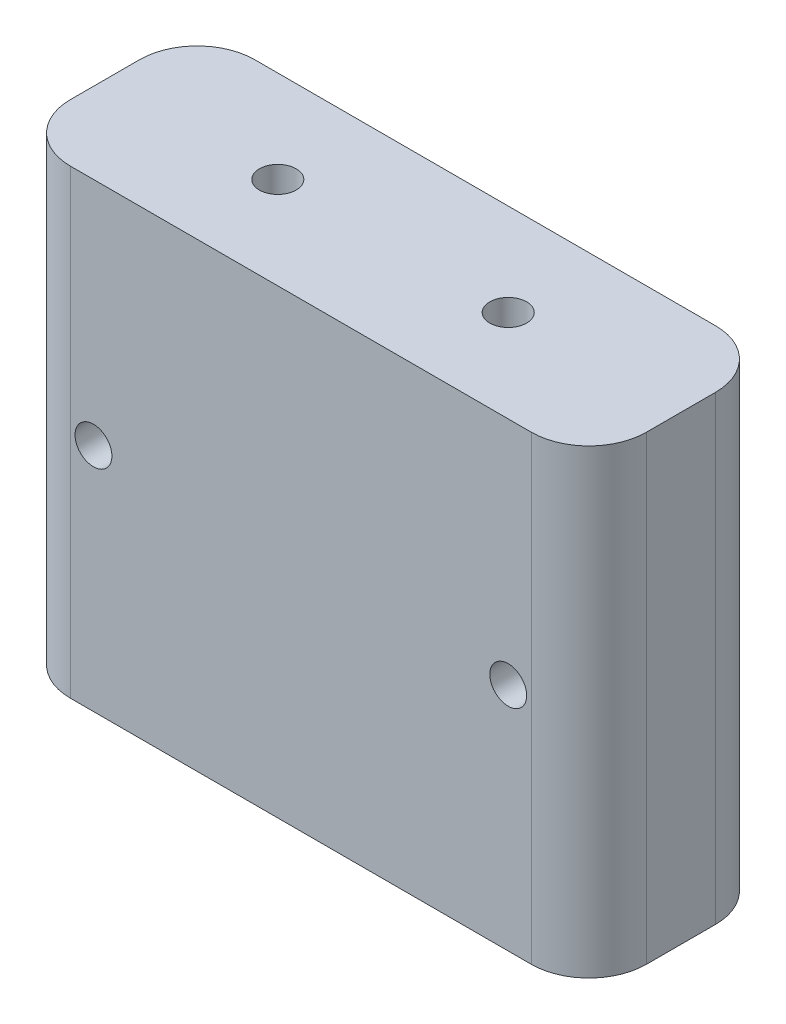
ISO-10303-21;
HEADER;
FILE_DESCRIPTION(('STEP AP214'),'2;1');
FILE_NAME('part.step','',(''),(''),'','','');
FILE_SCHEMA(('AUTOMOTIVE_DESIGN { 1 0 10303 214 1 1 1 1 }'));
ENDSEC;
DATA;
#1=APPLICATION_CONTEXT('core data for automotive mechanical design processes');
#2=APPLICATION_PROTOCOL_DEFINITION('international standard','automotive_design',2000,#1);
#3=PRODUCT_CONTEXT('',#1,'mechanical');
#4=PRODUCT('Part','Part','',(#3));
#5=PRODUCT_RELATED_PRODUCT_CATEGORY('part','',(#4));
#6=PRODUCT_DEFINITION_FORMATION('','',#4);
#7=PRODUCT_DEFINITION_CONTEXT('part definition',#1,'design');
#8=PRODUCT_DEFINITION('design','',#6,#7);
#9=PRODUCT_DEFINITION_SHAPE('','',#8);
#10=(LENGTH_UNIT() NAMED_UNIT(*) SI_UNIT(.MILLI.,.METRE.));
#11=(NAMED_UNIT(*) PLANE_ANGLE_UNIT() SI_UNIT($,.RADIAN.));
#12=(NAMED_UNIT(*) SI_UNIT($,.STERADIAN.) SOLID_ANGLE_UNIT());
#13=UNCERTAINTY_MEASURE_WITH_UNIT(LENGTH_MEASURE(1.E-05),#10,'distance_accuracy_value','');
#14=(GEOMETRIC_REPRESENTATION_CONTEXT(3) GLOBAL_UNCERTAINTY_ASSIGNED_CONTEXT((#13)) GLOBAL_UNIT_ASSIGNED_CONTEXT((#10,
#11,#12)) REPRESENTATION_CONTEXT('',''));
#15=CARTESIAN_POINT('',(0.,0.,0.));
#16=DIRECTION('',(0.,0.,1.));
#17=DIRECTION('',(1.,0.,0.));
#18=AXIS2_PLACEMENT_3D('',#15,#16,#17);
#19=CARTESIAN_POINT('',(0.,40.,0.));
#20=DIRECTION('',(0.,-1.,0.));
#21=DIRECTION('',(0.,0.,-1.));
#22=AXIS2_PLACEMENT_3D('',#19,#20,#21);
#23=PLANE('',#22);
#24=DIRECTION('',(0.,0.,-1.));
#25=VECTOR('',#24,1.);
#26=CARTESIAN_POINT('',(50.,40.,0.));
#27=LINE('',#26,#25);
#28=CARTESIAN_POINT('',(50.,40.,-5.));
#29=VERTEX_POINT('',#28);
#30=CARTESIAN_POINT('',(50.,40.,-11.));
#31=VERTEX_POINT('',#30);
#32=EDGE_CURVE('E196',#29,#31,#27,.T.);
#33=ORIENTED_EDGE('',*,*,#32,.T.);
#34=CARTESIAN_POINT('',(45.,40.,-11.));
#35=DIRECTION('',(0.,-1.,0.));
#36=DIRECTION('',(0.,0.,-1.));
#37=AXIS2_PLACEMENT_3D('',#34,#35,#36);
#38=CIRCLE('',#37,5.);
#39=CARTESIAN_POINT('',(45.,40.,-16.));
#40=VERTEX_POINT('',#39);
#41=EDGE_CURVE('E172',#31,#40,#38,.F.);
#42=ORIENTED_EDGE('',*,*,#41,.T.);
#43=DIRECTION('',(-1.,0.,0.));
#44=VECTOR('',#43,1.);
#45=CARTESIAN_POINT('',(0.,40.,-16.));
#46=LINE('',#45,#44);
#47=CARTESIAN_POINT('',(5.,40.,-16.));
#48=VERTEX_POINT('',#47);
#49=EDGE_CURVE('E130',#40,#48,#46,.T.);
#50=ORIENTED_EDGE('',*,*,#49,.T.);
#51=CARTESIAN_POINT('',(5.,40.,-11.));
#52=DIRECTION('',(0.,-1.,0.));
#53=DIRECTION('',(0.,0.,-1.));
#54=AXIS2_PLACEMENT_3D('',#51,#52,#53);
#55=CIRCLE('',#54,5.);
#56=CARTESIAN_POINT('',(0.,40.,-11.));
#57=VERTEX_POINT('',#56);
#58=EDGE_CURVE('E169',#48,#57,#55,.F.);
#59=ORIENTED_EDGE('',*,*,#58,.T.);
#60=DIRECTION('',(0.,0.,1.));
#61=VECTOR('',#60,1.);
#62=CARTESIAN_POINT('',(0.,40.,0.));
#63=LINE('',#62,#61);
#64=CARTESIAN_POINT('',(0.,40.,-5.));
#65=VERTEX_POINT('',#64);
#66=EDGE_CURVE('E139',#57,#65,#63,.T.);
#67=ORIENTED_EDGE('',*,*,#66,.T.);
#68=CARTESIAN_POINT('',(5.,40.,-5.));
#69=DIRECTION('',(0.,-1.,0.));
#70=DIRECTION('',(0.,0.,-1.));
#71=AXIS2_PLACEMENT_3D('',#68,#69,#70);
#72=CIRCLE('',#71,5.);
#73=CARTESIAN_POINT('',(5.,40.,0.));
#74=VERTEX_POINT('',#73);
#75=EDGE_CURVE('E64',#65,#74,#72,.F.);
#76=ORIENTED_EDGE('',*,*,#75,.T.);
#77=DIRECTION('',(1.,0.,0.));
#78=VECTOR('',#77,1.);
#79=CARTESIAN_POINT('',(0.,40.,0.));
#80=LINE('',#79,#78);
#81=CARTESIAN_POINT('',(45.,40.,0.));
#82=VERTEX_POINT('',#81);
#83=EDGE_CURVE('E144',#74,#82,#80,.T.);
#84=ORIENTED_EDGE('',*,*,#83,.T.);
#85=CARTESIAN_POINT('',(45.,40.,-5.));
#86=DIRECTION('',(0.,-1.,0.));
#87=DIRECTION('',(0.,0.,-1.));
#88=AXIS2_PLACEMENT_3D('',#85,#86,#87);
#89=CIRCLE('',#88,5.);
#90=EDGE_CURVE('E166',#82,#29,#89,.F.);
#91=ORIENTED_EDGE('',*,*,#90,.T.);
#92=EDGE_LOOP('',(#33,#42,#50,#59,#67,#76,#84,#91));
#93=FACE_BOUND('',#92,.T.);
#94=CARTESIAN_POINT('',(15.,40.,-8.));
#95=DIRECTION('',(0.,1.,0.));
#96=DIRECTION('',(0.,0.,1.));
#97=AXIS2_PLACEMENT_3D('',#94,#95,#96);
#98=CIRCLE('',#97,1.6);
#99=CARTESIAN_POINT('',(15.,40.,-6.4));
#100=VERTEX_POINT('',#99);
#101=EDGE_CURVE('E191',#100,#100,#98,.T.);
#102=ORIENTED_EDGE('',*,*,#101,.F.);
#103=EDGE_LOOP('',(#102));
#104=FACE_BOUND('',#103,.T.);
#105=CARTESIAN_POINT('',(35.,40.,-8.));
#106=DIRECTION('',(0.,1.,0.));
#107=DIRECTION('',(0.,0.,1.));
#108=AXIS2_PLACEMENT_3D('',#105,#106,#107);
#109=CIRCLE('',#108,1.6);
#110=CARTESIAN_POINT('',(35.,40.,-6.4));
#111=VERTEX_POINT('',#110);
#112=EDGE_CURVE('E206',#111,#111,#109,.T.);
#113=ORIENTED_EDGE('',*,*,#112,.F.);
#114=EDGE_LOOP('',(#113));
#115=FACE_BOUND('',#114,.T.);
#116=ADVANCED_FACE('F43',(#93,#104,#115),#23,.F.);
#117=CARTESIAN_POINT('',(0.,0.,0.));
#118=DIRECTION('',(0.,-1.,0.));
#119=DIRECTION('',(0.,0.,-1.));
#120=AXIS2_PLACEMENT_3D('',#117,#118,#119);
#121=PLANE('',#120);
#122=CARTESIAN_POINT('',(15.,0.,-8.));
#123=DIRECTION('',(0.,1.,0.));
#124=DIRECTION('',(0.,0.,1.));
#125=AXIS2_PLACEMENT_3D('',#122,#123,#124);
#126=CIRCLE('',#125,1.6);
#127=CARTESIAN_POINT('',(15.,0.,-6.4));
#128=VERTEX_POINT('',#127);
#129=EDGE_CURVE('E202',#128,#128,#126,.T.);
#130=ORIENTED_EDGE('',*,*,#129,.T.);
#131=EDGE_LOOP('',(#130));
#132=FACE_BOUND('',#131,.T.);
#133=DIRECTION('',(-1.,0.,0.));
#134=VECTOR('',#133,1.);
#135=CARTESIAN_POINT('',(0.,0.,-16.));
#136=LINE('',#135,#134);
#137=CARTESIAN_POINT('',(45.,0.,-16.));
#138=VERTEX_POINT('',#137);
#139=CARTESIAN_POINT('',(5.,0.,-16.));
#140=VERTEX_POINT('',#139);
#141=EDGE_CURVE('E127',#138,#140,#136,.T.);
#142=ORIENTED_EDGE('',*,*,#141,.F.);
#143=CARTESIAN_POINT('',(45.,0.,-11.));
#144=DIRECTION('',(0.,-1.,0.));
#145=DIRECTION('',(0.,0.,-1.));
#146=AXIS2_PLACEMENT_3D('',#143,#144,#145);
#147=CIRCLE('',#146,5.);
#148=CARTESIAN_POINT('',(50.,0.,-11.));
#149=VERTEX_POINT('',#148);
#150=EDGE_CURVE('E109',#138,#149,#147,.T.);
#151=ORIENTED_EDGE('',*,*,#150,.T.);
#152=DIRECTION('',(0.,0.,-1.));
#153=VECTOR('',#152,1.);
#154=CARTESIAN_POINT('',(50.,0.,0.));
#155=LINE('',#154,#153);
#156=CARTESIAN_POINT('',(50.,0.,-5.));
#157=VERTEX_POINT('',#156);
#158=EDGE_CURVE('E140',#157,#149,#155,.T.);
#159=ORIENTED_EDGE('',*,*,#158,.F.);
#160=CARTESIAN_POINT('',(45.,0.,-5.));
#161=DIRECTION('',(0.,-1.,0.));
#162=DIRECTION('',(0.,0.,-1.));
#163=AXIS2_PLACEMENT_3D('',#160,#161,#162);
#164=CIRCLE('',#163,5.);
#165=CARTESIAN_POINT('',(45.,0.,0.));
#166=VERTEX_POINT('',#165);
#167=EDGE_CURVE('E154',#157,#166,#164,.T.);
#168=ORIENTED_EDGE('',*,*,#167,.T.);
#169=DIRECTION('',(1.,0.,0.));
#170=VECTOR('',#169,1.);
#171=CARTESIAN_POINT('',(0.,0.,0.));
#172=LINE('',#171,#170);
#173=CARTESIAN_POINT('',(5.,0.,0.));
#174=VERTEX_POINT('',#173);
#175=EDGE_CURVE('E146',#174,#166,#172,.T.);
#176=ORIENTED_EDGE('',*,*,#175,.F.);
#177=CARTESIAN_POINT('',(5.,0.,-5.));
#178=DIRECTION('',(0.,-1.,0.));
#179=DIRECTION('',(0.,0.,-1.));
#180=AXIS2_PLACEMENT_3D('',#177,#178,#179);
#181=CIRCLE('',#180,5.);
#182=CARTESIAN_POINT('',(0.,0.,-5.));
#183=VERTEX_POINT('',#182);
#184=EDGE_CURVE('E132',#174,#183,#181,.T.);
#185=ORIENTED_EDGE('',*,*,#184,.T.);
#186=DIRECTION('',(0.,0.,1.));
#187=VECTOR('',#186,1.);
#188=CARTESIAN_POINT('',(0.,0.,0.));
#189=LINE('',#188,#187);
#190=CARTESIAN_POINT('',(0.,0.,-11.));
#191=VERTEX_POINT('',#190);
#192=EDGE_CURVE('E189',#191,#183,#189,.T.);
#193=ORIENTED_EDGE('',*,*,#192,.F.);
#194=CARTESIAN_POINT('',(5.,0.,-11.));
#195=DIRECTION('',(0.,-1.,0.));
#196=DIRECTION('',(0.,0.,-1.));
#197=AXIS2_PLACEMENT_3D('',#194,#195,#196);
#198=CIRCLE('',#197,5.);
#199=EDGE_CURVE('E121',#191,#140,#198,.T.);
#200=ORIENTED_EDGE('',*,*,#199,.T.);
#201=EDGE_LOOP('',(#142,#151,#159,#168,#176,#185,#193,#200));
#202=FACE_BOUND('',#201,.T.);
#203=CARTESIAN_POINT('',(35.,0.,-8.));
#204=DIRECTION('',(0.,1.,0.));
#205=DIRECTION('',(0.,0.,1.));
#206=AXIS2_PLACEMENT_3D('',#203,#204,#205);
#207=CIRCLE('',#206,1.6);
#208=CARTESIAN_POINT('',(35.,0.,-6.4));
#209=VERTEX_POINT('',#208);
#210=EDGE_CURVE('E210',#209,#209,#207,.T.);
#211=ORIENTED_EDGE('',*,*,#210,.T.);
#212=EDGE_LOOP('',(#211));
#213=FACE_BOUND('',#212,.T.);
#214=ADVANCED_FACE('F135',(#132,#202,#213),#121,.T.);
#215=CARTESIAN_POINT('',(0.,40.,0.));
#216=DIRECTION('',(1.,0.,0.));
#217=DIRECTION('',(0.,0.,-1.));
#218=AXIS2_PLACEMENT_3D('',#215,#216,#217);
#219=PLANE('',#218);
#220=ORIENTED_EDGE('',*,*,#66,.F.);
#221=DIRECTION('',(0.,-1.,0.));
#222=VECTOR('',#221,1.);
#223=CARTESIAN_POINT('',(0.,40.,-11.));
#224=LINE('',#223,#222);
#225=EDGE_CURVE('E178',#57,#191,#224,.T.);
#226=ORIENTED_EDGE('',*,*,#225,.T.);
#227=ORIENTED_EDGE('',*,*,#192,.T.);
#228=DIRECTION('',(0.,-1.,0.));
#229=VECTOR('',#228,1.);
#230=CARTESIAN_POINT('',(0.,40.,-5.));
#231=LINE('',#230,#229);
#232=EDGE_CURVE('E175',#183,#65,#231,.F.);
#233=ORIENTED_EDGE('',*,*,#232,.T.);
#234=EDGE_LOOP('',(#220,#226,#227,#233));
#235=FACE_BOUND('',#234,.T.);
#236=ADVANCED_FACE('F246',(#235),#219,.F.);
#237=CARTESIAN_POINT('',(0.,40.,0.));
#238=DIRECTION('',(0.,0.,-1.));
#239=DIRECTION('',(-1.,0.,0.));
#240=AXIS2_PLACEMENT_3D('',#237,#238,#239);
#241=PLANE('',#240);
#242=CARTESIAN_POINT('',(7.,20.,0.));
#243=DIRECTION('',(0.,0.,1.));
#244=DIRECTION('',(1.,0.,0.));
#245=AXIS2_PLACEMENT_3D('',#242,#243,#244);
#246=CIRCLE('',#245,1.6);
#247=CARTESIAN_POINT('',(8.6,20.,0.));
#248=VERTEX_POINT('',#247);
#249=EDGE_CURVE('E226',#248,#248,#246,.T.);
#250=ORIENTED_EDGE('',*,*,#249,.F.);
#251=EDGE_LOOP('',(#250));
#252=FACE_BOUND('',#251,.T.);
#253=CARTESIAN_POINT('',(43.,20.,0.));
#254=DIRECTION('',(0.,0.,1.));
#255=DIRECTION('',(1.,0.,0.));
#256=AXIS2_PLACEMENT_3D('',#253,#254,#255);
#257=CIRCLE('',#256,1.6);
#258=CARTESIAN_POINT('',(44.6,20.,0.));
#259=VERTEX_POINT('',#258);
#260=EDGE_CURVE('E222',#259,#259,#257,.T.);
#261=ORIENTED_EDGE('',*,*,#260,.F.);
#262=EDGE_LOOP('',(#261));
#263=FACE_BOUND('',#262,.T.);
#264=ORIENTED_EDGE('',*,*,#175,.T.);
#265=DIRECTION('',(0.,-1.,0.));
#266=VECTOR('',#265,1.);
#267=CARTESIAN_POINT('',(45.,40.,0.));
#268=LINE('',#267,#266);
#269=EDGE_CURVE('E11',#166,#82,#268,.F.);
#270=ORIENTED_EDGE('',*,*,#269,.T.);
#271=ORIENTED_EDGE('',*,*,#83,.F.);
#272=DIRECTION('',(0.,-1.,0.));
#273=VECTOR('',#272,1.);
#274=CARTESIAN_POINT('',(5.,40.,0.));
#275=LINE('',#274,#273);
#276=EDGE_CURVE('E52',#74,#174,#275,.T.);
#277=ORIENTED_EDGE('',*,*,#276,.T.);
#278=EDGE_LOOP('',(#264,#270,#271,#277));
#279=FACE_BOUND('',#278,.T.);
#280=ADVANCED_FACE('F185',(#252,#263,#279),#241,.F.);
#281=CARTESIAN_POINT('',(50.,40.,0.));
#282=DIRECTION('',(-1.,0.,0.));
#283=DIRECTION('',(0.,0.,1.));
#284=AXIS2_PLACEMENT_3D('',#281,#282,#283);
#285=PLANE('',#284);
#286=ORIENTED_EDGE('',*,*,#158,.T.);
#287=DIRECTION('',(0.,-1.,0.));
#288=VECTOR('',#287,1.);
#289=CARTESIAN_POINT('',(50.,40.,-11.));
#290=LINE('',#289,#288);
#291=EDGE_CURVE('E114',#149,#31,#290,.F.);
#292=ORIENTED_EDGE('',*,*,#291,.T.);
#293=ORIENTED_EDGE('',*,*,#32,.F.);
#294=DIRECTION('',(0.,-1.,0.));
#295=VECTOR('',#294,1.);
#296=CARTESIAN_POINT('',(50.,40.,-5.));
#297=LINE('',#296,#295);
#298=EDGE_CURVE('E120',#29,#157,#297,.T.);
#299=ORIENTED_EDGE('',*,*,#298,.T.);
#300=EDGE_LOOP('',(#286,#292,#293,#299));
#301=FACE_BOUND('',#300,.T.);
#302=ADVANCED_FACE('F245',(#301),#285,.F.);
#303=CARTESIAN_POINT('',(0.,40.,-16.));
#304=DIRECTION('',(0.,0.,1.));
#305=DIRECTION('',(1.,0.,0.));
#306=AXIS2_PLACEMENT_3D('',#303,#304,#305);
#307=PLANE('',#306);
#308=CARTESIAN_POINT('',(7.,20.,-16.));
#309=DIRECTION('',(0.,0.,1.));
#310=DIRECTION('',(1.,0.,0.));
#311=AXIS2_PLACEMENT_3D('',#308,#309,#310);
#312=CIRCLE('',#311,1.6);
#313=CARTESIAN_POINT('',(8.6,20.,-16.));
#314=VERTEX_POINT('',#313);
#315=EDGE_CURVE('E214',#314,#314,#312,.T.);
#316=ORIENTED_EDGE('',*,*,#315,.T.);
#317=EDGE_LOOP('',(#316));
#318=FACE_BOUND('',#317,.T.);
#319=CARTESIAN_POINT('',(43.,20.,-16.));
#320=DIRECTION('',(0.,0.,1.));
#321=DIRECTION('',(1.,0.,0.));
#322=AXIS2_PLACEMENT_3D('',#319,#320,#321);
#323=CIRCLE('',#322,1.6);
#324=CARTESIAN_POINT('',(44.6,20.,-16.));
#325=VERTEX_POINT('',#324);
#326=EDGE_CURVE('E218',#325,#325,#323,.T.);
#327=ORIENTED_EDGE('',*,*,#326,.T.);
#328=EDGE_LOOP('',(#327));
#329=FACE_BOUND('',#328,.T.);
#330=ORIENTED_EDGE('',*,*,#49,.F.);
#331=DIRECTION('',(0.,-1.,0.));
#332=VECTOR('',#331,1.);
#333=CARTESIAN_POINT('',(45.,40.,-16.));
#334=LINE('',#333,#332);
#335=EDGE_CURVE('E113',#40,#138,#334,.T.);
#336=ORIENTED_EDGE('',*,*,#335,.T.);
#337=ORIENTED_EDGE('',*,*,#141,.T.);
#338=DIRECTION('',(0.,-1.,0.));
#339=VECTOR('',#338,1.);
#340=CARTESIAN_POINT('',(5.,40.,-16.));
#341=LINE('',#340,#339);
#342=EDGE_CURVE('E133',#140,#48,#341,.F.);
#343=ORIENTED_EDGE('',*,*,#342,.T.);
#344=EDGE_LOOP('',(#330,#336,#337,#343));
#345=FACE_BOUND('',#344,.T.);
#346=ADVANCED_FACE('F126',(#318,#329,#345),#307,.F.);
#347=CARTESIAN_POINT('',(15.,40.,-8.));
#348=DIRECTION('',(0.,-1.,0.));
#349=DIRECTION('',(0.,0.,-1.));
#350=AXIS2_PLACEMENT_3D('',#347,#348,#349);
#351=CYLINDRICAL_SURFACE('',#350,1.6);
#352=ORIENTED_EDGE('',*,*,#101,.T.);
#353=EDGE_LOOP('',(#352));
#354=FACE_BOUND('',#353,.T.);
#355=ORIENTED_EDGE('',*,*,#129,.F.);
#356=EDGE_LOOP('',(#355));
#357=FACE_BOUND('',#356,.T.);
#358=ADVANCED_FACE('F257',(#354,#357),#351,.F.);
#359=CARTESIAN_POINT('',(35.,40.,-8.));
#360=DIRECTION('',(0.,-1.,0.));
#361=DIRECTION('',(0.,0.,-1.));
#362=AXIS2_PLACEMENT_3D('',#359,#360,#361);
#363=CYLINDRICAL_SURFACE('',#362,1.6);
#364=ORIENTED_EDGE('',*,*,#112,.T.);
#365=EDGE_LOOP('',(#364));
#366=FACE_BOUND('',#365,.T.);
#367=ORIENTED_EDGE('',*,*,#210,.F.);
#368=EDGE_LOOP('',(#367));
#369=FACE_BOUND('',#368,.T.);
#370=ADVANCED_FACE('F251',(#366,#369),#363,.F.);
#371=CARTESIAN_POINT('',(43.,20.,-16.));
#372=DIRECTION('',(0.,0.,1.));
#373=DIRECTION('',(1.,0.,0.));
#374=AXIS2_PLACEMENT_3D('',#371,#372,#373);
#375=CYLINDRICAL_SURFACE('',#374,1.6);
#376=ORIENTED_EDGE('',*,*,#326,.F.);
#377=EDGE_LOOP('',(#376));
#378=FACE_BOUND('',#377,.T.);
#379=ORIENTED_EDGE('',*,*,#260,.T.);
#380=EDGE_LOOP('',(#379));
#381=FACE_BOUND('',#380,.T.);
#382=ADVANCED_FACE('F239',(#378,#381),#375,.F.);
#383=CARTESIAN_POINT('',(7.,20.,-16.));
#384=DIRECTION('',(0.,0.,1.));
#385=DIRECTION('',(1.,0.,0.));
#386=AXIS2_PLACEMENT_3D('',#383,#384,#385);
#387=CYLINDRICAL_SURFACE('',#386,1.6);
#388=ORIENTED_EDGE('',*,*,#315,.F.);
#389=EDGE_LOOP('',(#388));
#390=FACE_BOUND('',#389,.T.);
#391=ORIENTED_EDGE('',*,*,#249,.T.);
#392=EDGE_LOOP('',(#391));
#393=FACE_BOUND('',#392,.T.);
#394=ADVANCED_FACE('F236',(#390,#393),#387,.F.);
#395=CARTESIAN_POINT('',(45.,40.,-11.));
#396=DIRECTION('',(0.,-1.,0.));
#397=DIRECTION('',(0.,0.,-1.));
#398=AXIS2_PLACEMENT_3D('',#395,#396,#397);
#399=CYLINDRICAL_SURFACE('',#398,5.);
#400=ORIENTED_EDGE('',*,*,#41,.F.);
#401=ORIENTED_EDGE('',*,*,#291,.F.);
#402=ORIENTED_EDGE('',*,*,#150,.F.);
#403=ORIENTED_EDGE('',*,*,#335,.F.);
#404=EDGE_LOOP('',(#400,#401,#402,#403));
#405=FACE_BOUND('',#404,.T.);
#406=ADVANCED_FACE('F112',(#405),#399,.T.);
#407=CARTESIAN_POINT('',(5.,40.,-11.));
#408=DIRECTION('',(0.,-1.,0.));
#409=DIRECTION('',(0.,0.,-1.));
#410=AXIS2_PLACEMENT_3D('',#407,#408,#409);
#411=CYLINDRICAL_SURFACE('',#410,5.);
#412=ORIENTED_EDGE('',*,*,#58,.F.);
#413=ORIENTED_EDGE('',*,*,#342,.F.);
#414=ORIENTED_EDGE('',*,*,#199,.F.);
#415=ORIENTED_EDGE('',*,*,#225,.F.);
#416=EDGE_LOOP('',(#412,#413,#414,#415));
#417=FACE_BOUND('',#416,.T.);
#418=ADVANCED_FACE('F281',(#417),#411,.T.);
#419=CARTESIAN_POINT('',(45.,40.,-5.));
#420=DIRECTION('',(0.,-1.,0.));
#421=DIRECTION('',(0.,0.,-1.));
#422=AXIS2_PLACEMENT_3D('',#419,#420,#421);
#423=CYLINDRICAL_SURFACE('',#422,5.);
#424=ORIENTED_EDGE('',*,*,#90,.F.);
#425=ORIENTED_EDGE('',*,*,#269,.F.);
#426=ORIENTED_EDGE('',*,*,#167,.F.);
#427=ORIENTED_EDGE('',*,*,#298,.F.);
#428=EDGE_LOOP('',(#424,#425,#426,#427));
#429=FACE_BOUND('',#428,.T.);
#430=ADVANCED_FACE('F283',(#429),#423,.T.);
#431=CARTESIAN_POINT('',(5.,40.,-5.));
#432=DIRECTION('',(0.,-1.,0.));
#433=DIRECTION('',(0.,0.,-1.));
#434=AXIS2_PLACEMENT_3D('',#431,#432,#433);
#435=CYLINDRICAL_SURFACE('',#434,5.);
#436=ORIENTED_EDGE('',*,*,#75,.F.);
#437=ORIENTED_EDGE('',*,*,#232,.F.);
#438=ORIENTED_EDGE('',*,*,#184,.F.);
#439=ORIENTED_EDGE('',*,*,#276,.F.);
#440=EDGE_LOOP('',(#436,#437,#438,#439));
#441=FACE_BOUND('',#440,.T.);
#442=ADVANCED_FACE('F45',(#441),#435,.T.);
#443=CLOSED_SHELL('',(#116,#214,#236,#280,#302,#346,#358,#370,#382,#394,#406,#418,#430,#442));
#444=MANIFOLD_SOLID_BREP('B2',#443);
#445=ADVANCED_BREP_SHAPE_REPRESENTATION('',(#18,#444),#14);
#446=SHAPE_DEFINITION_REPRESENTATION(#9,#445);
ENDSEC;
END-ISO-10303-21;
